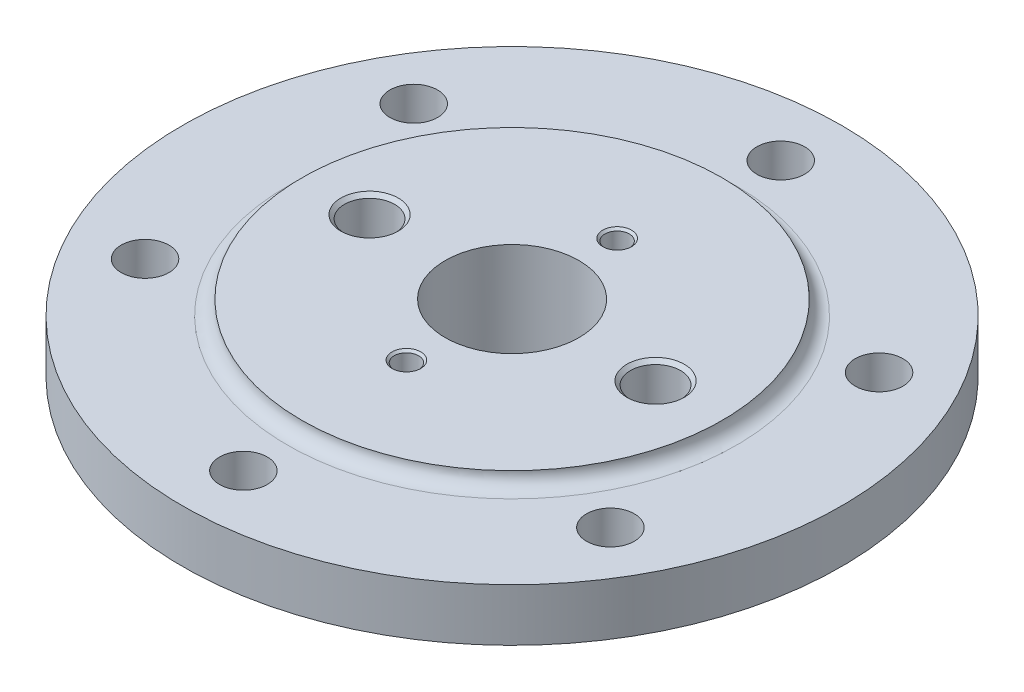
ISO-10303-21;
HEADER;
FILE_DESCRIPTION(('STEP AP214'),'2;1');
FILE_NAME('part.step','',(''),(''),'','','');
FILE_SCHEMA(('AUTOMOTIVE_DESIGN { 1 0 10303 214 1 1 1 1 }'));
ENDSEC;
DATA;
#1=APPLICATION_CONTEXT('core data for automotive mechanical design processes');
#2=APPLICATION_PROTOCOL_DEFINITION('international standard','automotive_design',2000,#1);
#3=PRODUCT_CONTEXT('',#1,'mechanical');
#4=PRODUCT('Part','Part','',(#3));
#5=PRODUCT_RELATED_PRODUCT_CATEGORY('part','',(#4));
#6=PRODUCT_DEFINITION_FORMATION('','',#4);
#7=PRODUCT_DEFINITION_CONTEXT('part definition',#1,'design');
#8=PRODUCT_DEFINITION('design','',#6,#7);
#9=PRODUCT_DEFINITION_SHAPE('','',#8);
#10=(LENGTH_UNIT() NAMED_UNIT(*) SI_UNIT(.MILLI.,.METRE.));
#11=(NAMED_UNIT(*) PLANE_ANGLE_UNIT() SI_UNIT($,.RADIAN.));
#12=(NAMED_UNIT(*) SI_UNIT($,.STERADIAN.) SOLID_ANGLE_UNIT());
#13=UNCERTAINTY_MEASURE_WITH_UNIT(LENGTH_MEASURE(1.E-05),#10,'distance_accuracy_value','');
#14=(GEOMETRIC_REPRESENTATION_CONTEXT(3) GLOBAL_UNCERTAINTY_ASSIGNED_CONTEXT((#13)) GLOBAL_UNIT_ASSIGNED_CONTEXT((#10,
#11,#12)) REPRESENTATION_CONTEXT('',''));
#15=CARTESIAN_POINT('',(0.,0.,0.));
#16=DIRECTION('',(0.,0.,1.));
#17=DIRECTION('',(1.,0.,0.));
#18=AXIS2_PLACEMENT_3D('',#15,#16,#17);
#19=CARTESIAN_POINT('',(35.,0.,0.));
#20=DIRECTION('',(0.,-1.,0.));
#21=DIRECTION('',(0.,0.,-1.));
#22=AXIS2_PLACEMENT_3D('',#19,#20,#21);
#23=PLANE('',#22);
#24=CARTESIAN_POINT('',(0.,0.,0.));
#25=DIRECTION('',(0.,-1.,0.));
#26=DIRECTION('',(0.,0.,-1.));
#27=AXIS2_PLACEMENT_3D('',#24,#25,#26);
#28=CIRCLE('',#27,35.);
#29=CARTESIAN_POINT('',(0.,0.,-35.));
#30=VERTEX_POINT('',#29);
#31=EDGE_CURVE('E11',#30,#30,#28,.T.);
#32=ORIENTED_EDGE('',*,*,#31,.T.);
#33=EDGE_LOOP('',(#32));
#34=FACE_BOUND('',#33,.T.);
#35=CARTESIAN_POINT('',(0.,0.,0.));
#36=DIRECTION('',(0.,-1.,0.));
#37=DIRECTION('',(0.,0.,-1.));
#38=AXIS2_PLACEMENT_3D('',#35,#36,#37);
#39=CIRCLE('',#38,7.);
#40=CARTESIAN_POINT('',(0.,0.,-7.));
#41=VERTEX_POINT('',#40);
#42=EDGE_CURVE('E123',#41,#41,#39,.T.);
#43=ORIENTED_EDGE('',*,*,#42,.F.);
#44=EDGE_LOOP('',(#43));
#45=FACE_BOUND('',#44,.T.);
#46=ADVANCED_FACE('F47',(#34,#45),#23,.T.);
#47=CARTESIAN_POINT('',(0.,0.,0.));
#48=DIRECTION('',(0.,1.,0.));
#49=DIRECTION('',(0.,0.,1.));
#50=AXIS2_PLACEMENT_3D('',#47,#48,#49);
#51=CONICAL_SURFACE('',#50,35.,0.774645889606347);
#52=CARTESIAN_POINT('',(0.,47.,0.));
#53=DIRECTION('',(0.,-1.,0.));
#54=DIRECTION('',(0.,0.,-1.));
#55=AXIS2_PLACEMENT_3D('',#52,#53,#54);
#56=CIRCLE('',#55,81.);
#57=CARTESIAN_POINT('',(0.,47.,-81.));
#58=VERTEX_POINT('',#57);
#59=EDGE_CURVE('E55',#58,#58,#56,.T.);
#60=ORIENTED_EDGE('',*,*,#59,.T.);
#61=EDGE_LOOP('',(#60));
#62=FACE_BOUND('',#61,.T.);
#63=ORIENTED_EDGE('',*,*,#31,.F.);
#64=EDGE_LOOP('',(#63));
#65=FACE_BOUND('',#64,.T.);
#66=ADVANCED_FACE('F162',(#62,#65),#51,.T.);
#67=CARTESIAN_POINT('',(0.,0.,0.));
#68=DIRECTION('',(0.,-1.,0.));
#69=DIRECTION('',(0.,0.,-1.));
#70=AXIS2_PLACEMENT_3D('',#67,#68,#69);
#71=CYLINDRICAL_SURFACE('',#70,81.);
#72=CARTESIAN_POINT('',(0.,53.,0.));
#73=DIRECTION('',(0.,-1.,0.));
#74=DIRECTION('',(0.,0.,-1.));
#75=AXIS2_PLACEMENT_3D('',#72,#73,#74);
#76=CIRCLE('',#75,81.);
#77=CARTESIAN_POINT('',(0.,53.,-81.));
#78=VERTEX_POINT('',#77);
#79=EDGE_CURVE('E155',#78,#78,#76,.T.);
#80=ORIENTED_EDGE('',*,*,#79,.T.);
#81=EDGE_LOOP('',(#80));
#82=FACE_BOUND('',#81,.T.);
#83=ORIENTED_EDGE('',*,*,#59,.F.);
#84=EDGE_LOOP('',(#83));
#85=FACE_BOUND('',#84,.T.);
#86=ADVANCED_FACE('F165',(#82,#85),#71,.T.);
#87=CARTESIAN_POINT('',(138.,53.,0.));
#88=DIRECTION('',(0.,-1.,0.));
#89=DIRECTION('',(0.,0.,-1.));
#90=AXIS2_PLACEMENT_3D('',#87,#88,#89);
#91=PLANE('',#90);
#92=CARTESIAN_POINT('',(0.,53.,-112.5));
#93=DIRECTION('',(0.,-1.,0.));
#94=DIRECTION('',(0.,0.,-1.));
#95=AXIS2_PLACEMENT_3D('',#92,#93,#94);
#96=CIRCLE('',#95,10.);
#97=CARTESIAN_POINT('',(0.,53.,-122.5));
#98=VERTEX_POINT('',#97);
#99=EDGE_CURVE('E303',#98,#98,#96,.F.);
#100=ORIENTED_EDGE('',*,*,#99,.T.);
#101=EDGE_LOOP('',(#100));
#102=FACE_BOUND('',#101,.T.);
#103=CARTESIAN_POINT('',(-97.4278579257487,53.,-56.2500000000012));
#104=DIRECTION('',(0.,-1.,0.));
#105=DIRECTION('',(0.,0.,-1.));
#106=AXIS2_PLACEMENT_3D('',#103,#104,#105);
#107=CIRCLE('',#106,10.);
#108=CARTESIAN_POINT('',(-97.4278579257487,53.,-66.2500000000012));
#109=VERTEX_POINT('',#108);
#110=EDGE_CURVE('E314',#109,#109,#107,.F.);
#111=ORIENTED_EDGE('',*,*,#110,.T.);
#112=EDGE_LOOP('',(#111));
#113=FACE_BOUND('',#112,.T.);
#114=CARTESIAN_POINT('',(-97.4278579257499,53.,56.2499999999991));
#115=DIRECTION('',(0.,-1.,0.));
#116=DIRECTION('',(0.,0.,-1.));
#117=AXIS2_PLACEMENT_3D('',#114,#115,#116);
#118=CIRCLE('',#117,10.);
#119=CARTESIAN_POINT('',(-97.4278579257499,53.,46.2499999999991));
#120=VERTEX_POINT('',#119);
#121=EDGE_CURVE('E342',#120,#120,#118,.F.);
#122=ORIENTED_EDGE('',*,*,#121,.T.);
#123=EDGE_LOOP('',(#122));
#124=FACE_BOUND('',#123,.T.);
#125=CARTESIAN_POINT('',(-7.85583301239705E-13,53.,112.5));
#126=DIRECTION('',(0.,-1.,0.));
#127=DIRECTION('',(0.,0.,-1.));
#128=AXIS2_PLACEMENT_3D('',#125,#126,#127);
#129=CIRCLE('',#128,10.);
#130=CARTESIAN_POINT('',(-7.85583301239705E-13,53.,102.5));
#131=VERTEX_POINT('',#130);
#132=EDGE_CURVE('E334',#131,#131,#129,.F.);
#133=ORIENTED_EDGE('',*,*,#132,.T.);
#134=EDGE_LOOP('',(#133));
#135=FACE_BOUND('',#134,.T.);
#136=CARTESIAN_POINT('',(97.4278579257491,53.,56.2500000000005));
#137=DIRECTION('',(0.,-1.,0.));
#138=DIRECTION('',(0.,0.,-1.));
#139=AXIS2_PLACEMENT_3D('',#136,#137,#138);
#140=CIRCLE('',#139,10.);
#141=CARTESIAN_POINT('',(97.4278579257491,53.,46.2500000000005));
#142=VERTEX_POINT('',#141);
#143=EDGE_CURVE('E326',#142,#142,#140,.F.);
#144=ORIENTED_EDGE('',*,*,#143,.T.);
#145=EDGE_LOOP('',(#144));
#146=FACE_BOUND('',#145,.T.);
#147=CARTESIAN_POINT('',(97.4278579257495,53.,-56.2499999999998));
#148=DIRECTION('',(0.,-1.,0.));
#149=DIRECTION('',(0.,0.,-1.));
#150=AXIS2_PLACEMENT_3D('',#147,#148,#149);
#151=CIRCLE('',#150,9.99999999999999);
#152=CARTESIAN_POINT('',(97.4278579257495,53.,-66.2499999999998));
#153=VERTEX_POINT('',#152);
#154=EDGE_CURVE('E305',#153,#153,#151,.F.);
#155=ORIENTED_EDGE('',*,*,#154,.T.);
#156=EDGE_LOOP('',(#155));
#157=FACE_BOUND('',#156,.T.);
#158=CARTESIAN_POINT('',(0.,53.,0.));
#159=DIRECTION('',(0.,-1.,0.));
#160=DIRECTION('',(0.,0.,-1.));
#161=AXIS2_PLACEMENT_3D('',#158,#159,#160);
#162=CIRCLE('',#161,138.);
#163=CARTESIAN_POINT('',(0.,53.,-138.));
#164=VERTEX_POINT('',#163);
#165=EDGE_CURVE('E151',#164,#164,#162,.T.);
#166=ORIENTED_EDGE('',*,*,#165,.T.);
#167=EDGE_LOOP('',(#166));
#168=FACE_BOUND('',#167,.T.);
#169=ORIENTED_EDGE('',*,*,#79,.F.);
#170=EDGE_LOOP('',(#169));
#171=FACE_BOUND('',#170,.T.);
#172=ADVANCED_FACE('F167',(#102,#113,#124,#135,#146,#157,#168,#171),#91,.T.);
#173=CARTESIAN_POINT('',(0.,0.,0.));
#174=DIRECTION('',(0.,-1.,0.));
#175=DIRECTION('',(0.,0.,-1.));
#176=AXIS2_PLACEMENT_3D('',#173,#174,#175);
#177=CYLINDRICAL_SURFACE('',#176,138.);
#178=CARTESIAN_POINT('',(0.,75.,0.));
#179=DIRECTION('',(0.,-1.,0.));
#180=DIRECTION('',(0.,0.,-1.));
#181=AXIS2_PLACEMENT_3D('',#178,#179,#180);
#182=CIRCLE('',#181,138.);
#183=CARTESIAN_POINT('',(0.,75.,-138.));
#184=VERTEX_POINT('',#183);
#185=EDGE_CURVE('E147',#184,#184,#182,.T.);
#186=ORIENTED_EDGE('',*,*,#185,.T.);
#187=EDGE_LOOP('',(#186));
#188=FACE_BOUND('',#187,.T.);
#189=ORIENTED_EDGE('',*,*,#165,.F.);
#190=EDGE_LOOP('',(#189));
#191=FACE_BOUND('',#190,.T.);
#192=ADVANCED_FACE('F174',(#188,#191),#177,.T.);
#193=CARTESIAN_POINT('',(94.,75.,0.));
#194=DIRECTION('',(0.,1.,0.));
#195=DIRECTION('',(0.,0.,1.));
#196=AXIS2_PLACEMENT_3D('',#193,#194,#195);
#197=PLANE('',#196);
#198=CARTESIAN_POINT('',(0.,75.,-112.5));
#199=DIRECTION('',(0.,1.,0.));
#200=DIRECTION('',(0.,0.,1.));
#201=AXIS2_PLACEMENT_3D('',#198,#199,#200);
#202=CIRCLE('',#201,10.);
#203=CARTESIAN_POINT('',(0.,75.,-102.5));
#204=VERTEX_POINT('',#203);
#205=EDGE_CURVE('E300',#204,#204,#202,.T.);
#206=ORIENTED_EDGE('',*,*,#205,.F.);
#207=EDGE_LOOP('',(#206));
#208=FACE_BOUND('',#207,.T.);
#209=CARTESIAN_POINT('',(-97.4278579257487,75.,-56.2500000000012));
#210=DIRECTION('',(0.,1.,0.));
#211=DIRECTION('',(0.,0.,1.));
#212=AXIS2_PLACEMENT_3D('',#209,#210,#211);
#213=CIRCLE('',#212,10.);
#214=CARTESIAN_POINT('',(-97.4278579257487,75.,-46.2500000000012));
#215=VERTEX_POINT('',#214);
#216=EDGE_CURVE('E319',#215,#215,#213,.T.);
#217=ORIENTED_EDGE('',*,*,#216,.F.);
#218=EDGE_LOOP('',(#217));
#219=FACE_BOUND('',#218,.T.);
#220=CARTESIAN_POINT('',(-97.4278579257499,75.,56.2499999999991));
#221=DIRECTION('',(0.,1.,0.));
#222=DIRECTION('',(0.,0.,1.));
#223=AXIS2_PLACEMENT_3D('',#220,#221,#222);
#224=CIRCLE('',#223,10.);
#225=CARTESIAN_POINT('',(-97.4278579257499,75.,66.2499999999991));
#226=VERTEX_POINT('',#225);
#227=EDGE_CURVE('E318',#226,#226,#224,.T.);
#228=ORIENTED_EDGE('',*,*,#227,.F.);
#229=EDGE_LOOP('',(#228));
#230=FACE_BOUND('',#229,.T.);
#231=CARTESIAN_POINT('',(-7.85583301239705E-13,75.,112.5));
#232=DIRECTION('',(0.,1.,0.));
#233=DIRECTION('',(0.,0.,1.));
#234=AXIS2_PLACEMENT_3D('',#231,#232,#233);
#235=CIRCLE('',#234,10.);
#236=CARTESIAN_POINT('',(-7.85583301239705E-13,75.,122.5));
#237=VERTEX_POINT('',#236);
#238=EDGE_CURVE('E338',#237,#237,#235,.T.);
#239=ORIENTED_EDGE('',*,*,#238,.F.);
#240=EDGE_LOOP('',(#239));
#241=FACE_BOUND('',#240,.T.);
#242=CARTESIAN_POINT('',(97.4278579257491,75.,56.2500000000005));
#243=DIRECTION('',(0.,1.,0.));
#244=DIRECTION('',(0.,0.,1.));
#245=AXIS2_PLACEMENT_3D('',#242,#243,#244);
#246=CIRCLE('',#245,10.);
#247=CARTESIAN_POINT('',(97.4278579257491,75.,66.2500000000005));
#248=VERTEX_POINT('',#247);
#249=EDGE_CURVE('E330',#248,#248,#246,.T.);
#250=ORIENTED_EDGE('',*,*,#249,.F.);
#251=EDGE_LOOP('',(#250));
#252=FACE_BOUND('',#251,.T.);
#253=CARTESIAN_POINT('',(97.4278579257495,75.,-56.2499999999998));
#254=DIRECTION('',(0.,1.,0.));
#255=DIRECTION('',(0.,0.,1.));
#256=AXIS2_PLACEMENT_3D('',#253,#254,#255);
#257=CIRCLE('',#256,9.99999999999999);
#258=CARTESIAN_POINT('',(97.4278579257495,75.,-46.2499999999998));
#259=VERTEX_POINT('',#258);
#260=EDGE_CURVE('E311',#259,#259,#257,.T.);
#261=ORIENTED_EDGE('',*,*,#260,.F.);
#262=EDGE_LOOP('',(#261));
#263=FACE_BOUND('',#262,.T.);
#264=CARTESIAN_POINT('',(0.,75.,0.));
#265=DIRECTION('',(0.,-1.,0.));
#266=DIRECTION('',(0.,0.,-1.));
#267=AXIS2_PLACEMENT_3D('',#264,#265,#266);
#268=CIRCLE('',#267,94.);
#269=CARTESIAN_POINT('',(0.,75.,-94.));
#270=VERTEX_POINT('',#269);
#271=EDGE_CURVE('E143',#270,#270,#268,.T.);
#272=ORIENTED_EDGE('',*,*,#271,.T.);
#273=EDGE_LOOP('',(#272));
#274=FACE_BOUND('',#273,.T.);
#275=ORIENTED_EDGE('',*,*,#185,.F.);
#276=EDGE_LOOP('',(#275));
#277=FACE_BOUND('',#276,.T.);
#278=ADVANCED_FACE('F214',(#208,#219,#230,#241,#252,#263,#274,#277),#197,.T.);
#279=CARTESIAN_POINT('',(0.,81.,0.));
#280=DIRECTION('',(0.,-1.,0.));
#281=DIRECTION('',(0.,0.,-1.));
#282=AXIS2_PLACEMENT_3D('',#279,#280,#281);
#283=TOROIDAL_SURFACE('',#282,94.,6.00000000000001);
#284=CARTESIAN_POINT('',(0.,81.,0.));
#285=DIRECTION('',(0.,-1.,0.));
#286=DIRECTION('',(0.,0.,-1.));
#287=AXIS2_PLACEMENT_3D('',#284,#285,#286);
#288=CIRCLE('',#287,88.);
#289=CARTESIAN_POINT('',(0.,81.,-88.));
#290=VERTEX_POINT('',#289);
#291=EDGE_CURVE('E139',#290,#290,#288,.T.);
#292=ORIENTED_EDGE('',*,*,#291,.T.);
#293=EDGE_LOOP('',(#292));
#294=FACE_BOUND('',#293,.T.);
#295=ORIENTED_EDGE('',*,*,#271,.F.);
#296=EDGE_LOOP('',(#295));
#297=FACE_BOUND('',#296,.T.);
#298=ADVANCED_FACE('F207',(#294,#297),#283,.F.);
#299=CARTESIAN_POINT('',(28.,81.,0.));
#300=DIRECTION('',(0.,1.,0.));
#301=DIRECTION('',(0.,0.,1.));
#302=AXIS2_PLACEMENT_3D('',#299,#300,#301);
#303=PLANE('',#302);
#304=CARTESIAN_POINT('',(-60.4802197209113,81.,-0.806402929612432));
#305=DIRECTION('',(0.,1.,0.));
#306=DIRECTION('',(0.,0.,1.));
#307=AXIS2_PLACEMENT_3D('',#304,#305,#306);
#308=CIRCLE('',#307,12.025);
#309=CARTESIAN_POINT('',(-60.4802197209113,81.,11.2185970703876));
#310=VERTEX_POINT('',#309);
#311=EDGE_CURVE('E88',#310,#310,#308,.T.);
#312=ORIENTED_EDGE('',*,*,#311,.F.);
#313=EDGE_LOOP('',(#312));
#314=FACE_BOUND('',#313,.T.);
#315=CARTESIAN_POINT('',(59.6738167912991,81.,-0.403201464806357));
#316=DIRECTION('',(0.,1.,0.));
#317=DIRECTION('',(0.,0.,1.));
#318=AXIS2_PLACEMENT_3D('',#315,#316,#317);
#319=CIRCLE('',#318,12.025);
#320=CARTESIAN_POINT('',(59.6738167912991,81.,11.6217985351937));
#321=VERTEX_POINT('',#320);
#322=EDGE_CURVE('E79',#321,#321,#319,.T.);
#323=ORIENTED_EDGE('',*,*,#322,.F.);
#324=EDGE_LOOP('',(#323));
#325=FACE_BOUND('',#324,.T.);
#326=CARTESIAN_POINT('',(0.,81.,-44.));
#327=DIRECTION('',(0.,1.,0.));
#328=DIRECTION('',(0.,0.,1.));
#329=AXIS2_PLACEMENT_3D('',#326,#327,#328);
#330=CIRCLE('',#329,6.025);
#331=CARTESIAN_POINT('',(0.,81.,-37.975));
#332=VERTEX_POINT('',#331);
#333=EDGE_CURVE('E99',#332,#332,#330,.T.);
#334=ORIENTED_EDGE('',*,*,#333,.F.);
#335=EDGE_LOOP('',(#334));
#336=FACE_BOUND('',#335,.T.);
#337=CARTESIAN_POINT('',(0.0355318338733923,81.,44.2777289266019));
#338=DIRECTION('',(0.,1.,0.));
#339=DIRECTION('',(0.,0.,1.));
#340=AXIS2_PLACEMENT_3D('',#337,#338,#339);
#341=CIRCLE('',#340,6.025);
#342=CARTESIAN_POINT('',(0.0355318338733923,81.,50.3027289266019));
#343=VERTEX_POINT('',#342);
#344=EDGE_CURVE('E111',#343,#343,#341,.T.);
#345=ORIENTED_EDGE('',*,*,#344,.F.);
#346=EDGE_LOOP('',(#345));
#347=FACE_BOUND('',#346,.T.);
#348=CARTESIAN_POINT('',(0.,81.,0.));
#349=DIRECTION('',(0.,-1.,0.));
#350=DIRECTION('',(0.,0.,-1.));
#351=AXIS2_PLACEMENT_3D('',#348,#349,#350);
#352=CIRCLE('',#351,28.);
#353=CARTESIAN_POINT('',(0.,81.,-28.));
#354=VERTEX_POINT('',#353);
#355=EDGE_CURVE('E135',#354,#354,#352,.T.);
#356=ORIENTED_EDGE('',*,*,#355,.T.);
#357=EDGE_LOOP('',(#356));
#358=FACE_BOUND('',#357,.T.);
#359=ORIENTED_EDGE('',*,*,#291,.F.);
#360=EDGE_LOOP('',(#359));
#361=FACE_BOUND('',#360,.T.);
#362=ADVANCED_FACE('F201',(#314,#325,#336,#347,#358,#361),#303,.T.);
#363=CARTESIAN_POINT('',(0.,0.,0.));
#364=DIRECTION('',(0.,-1.,0.));
#365=DIRECTION('',(0.,0.,-1.));
#366=AXIS2_PLACEMENT_3D('',#363,#364,#365);
#367=CYLINDRICAL_SURFACE('',#366,28.);
#368=CARTESIAN_POINT('',(0.,33.,0.));
#369=DIRECTION('',(0.,-1.,0.));
#370=DIRECTION('',(0.,0.,-1.));
#371=AXIS2_PLACEMENT_3D('',#368,#369,#370);
#372=CIRCLE('',#371,28.);
#373=CARTESIAN_POINT('',(0.,33.,28.));
#374=VERTEX_POINT('',#373);
#375=EDGE_CURVE('E131',#374,#374,#372,.T.);
#376=ORIENTED_EDGE('',*,*,#375,.T.);
#377=EDGE_LOOP('',(#376));
#378=FACE_BOUND('',#377,.T.);
#379=ORIENTED_EDGE('',*,*,#355,.F.);
#380=EDGE_LOOP('',(#379));
#381=FACE_BOUND('',#380,.T.);
#382=ADVANCED_FACE('F195',(#378,#381),#367,.F.);
#383=CARTESIAN_POINT('',(0.,33.,0.));
#384=DIRECTION('',(0.,1.,0.));
#385=DIRECTION('',(0.,0.,1.));
#386=AXIS2_PLACEMENT_3D('',#383,#384,#385);
#387=CONICAL_SURFACE('',#386,28.,1.0471975511966);
#388=CARTESIAN_POINT('',(0.,20.8756443470179,0.));
#389=DIRECTION('',(0.,-1.,0.));
#390=DIRECTION('',(0.,0.,-1.));
#391=AXIS2_PLACEMENT_3D('',#388,#389,#390);
#392=CIRCLE('',#391,7.);
#393=CARTESIAN_POINT('',(0.,20.8756443470179,7.));
#394=VERTEX_POINT('',#393);
#395=EDGE_CURVE('E127',#394,#394,#392,.T.);
#396=CARTESIAN_POINT('',(0.,20.8756443470179,7.));
#397=CARTESIAN_POINT('',(0.,21.0019397184032,7.21875));
#398=CARTESIAN_POINT('',(0.,21.1282350897884,7.4375));
#399=CARTESIAN_POINT('',(0.,21.3808258325589,7.875));
#400=CARTESIAN_POINT('',(0.,21.5071212039441,8.09375));
#401=CARTESIAN_POINT('',(0.,21.7597119467145,8.53125));
#402=CARTESIAN_POINT('',(0.,21.8860073180998,8.75));
#403=CARTESIAN_POINT('',(0.,22.1385980608702,9.1875));
#404=CARTESIAN_POINT('',(0.,22.2648934322555,9.40625));
#405=CARTESIAN_POINT('',(0.,22.5174841750259,9.84375));
#406=CARTESIAN_POINT('',(0.,22.6437795464112,10.0625));
#407=CARTESIAN_POINT('',(0.,22.8963702891816,10.5));
#408=CARTESIAN_POINT('',(0.,23.0226656605668,10.71875));
#409=CARTESIAN_POINT('',(0.,23.2752564033373,11.15625));
#410=CARTESIAN_POINT('',(0.,23.4015517747225,11.375));
#411=CARTESIAN_POINT('',(0.,23.654142517493,11.8125));
#412=CARTESIAN_POINT('',(0.,23.7804378888782,12.03125));
#413=CARTESIAN_POINT('',(0.,24.0330286316487,12.46875));
#414=CARTESIAN_POINT('',(0.,24.1593240030339,12.6875));
#415=CARTESIAN_POINT('',(0.,24.4119147458044,13.125));
#416=CARTESIAN_POINT('',(0.,24.5382101171896,13.34375));
#417=CARTESIAN_POINT('',(0.,24.7908008599601,13.78125));
#418=CARTESIAN_POINT('',(0.,24.9170962313453,14.));
#419=CARTESIAN_POINT('',(0.,25.1696869741158,14.4375));
#420=CARTESIAN_POINT('',(0.,25.295982345501,14.65625));
#421=CARTESIAN_POINT('',(0.,25.5485730882714,15.09375));
#422=CARTESIAN_POINT('',(0.,25.6748684596567,15.3125));
#423=CARTESIAN_POINT('',(0.,25.9274592024271,15.75));
#424=CARTESIAN_POINT('',(0.,26.0537545738124,15.96875));
#425=CARTESIAN_POINT('',(0.,26.3063453165828,16.40625));
#426=CARTESIAN_POINT('',(0.,26.4326406879681,16.625));
#427=CARTESIAN_POINT('',(0.,26.6852314307385,17.0625));
#428=CARTESIAN_POINT('',(0.,26.8115268021237,17.28125));
#429=CARTESIAN_POINT('',(0.,27.0641175448942,17.71875));
#430=CARTESIAN_POINT('',(0.,27.1904129162794,17.9375));
#431=CARTESIAN_POINT('',(0.,27.4430036590499,18.375));
#432=CARTESIAN_POINT('',(0.,27.5692990304351,18.59375));
#433=CARTESIAN_POINT('',(0.,27.8218897732056,19.03125));
#434=CARTESIAN_POINT('',(0.,27.9481851445908,19.25));
#435=CARTESIAN_POINT('',(0.,28.2007758873613,19.6875));
#436=CARTESIAN_POINT('',(0.,28.3270712587465,19.90625));
#437=CARTESIAN_POINT('',(0.,28.579662001517,20.34375));
#438=CARTESIAN_POINT('',(0.,28.7059573729022,20.5625));
#439=CARTESIAN_POINT('',(0.,28.9585481156727,21.));
#440=CARTESIAN_POINT('',(0.,29.0848434870579,21.21875));
#441=CARTESIAN_POINT('',(0.,29.3374342298284,21.65625));
#442=CARTESIAN_POINT('',(0.,29.4637296012136,21.875));
#443=CARTESIAN_POINT('',(0.,29.716320343984,22.3125));
#444=CARTESIAN_POINT('',(0.,29.8426157153693,22.53125));
#445=CARTESIAN_POINT('',(0.,30.0952064581397,22.96875));
#446=CARTESIAN_POINT('',(0.,30.221501829525,23.1875));
#447=CARTESIAN_POINT('',(0.,30.4740925722954,23.625));
#448=CARTESIAN_POINT('',(0.,30.6003879436807,23.84375));
#449=CARTESIAN_POINT('',(0.,30.8529786864511,24.28125));
#450=CARTESIAN_POINT('',(0.,30.9792740578363,24.5));
#451=CARTESIAN_POINT('',(0.,31.2318648006068,24.9375));
#452=CARTESIAN_POINT('',(0.,31.358160171992,25.15625));
#453=CARTESIAN_POINT('',(0.,31.6107509147625,25.59375));
#454=CARTESIAN_POINT('',(0.,31.7370462861477,25.8125));
#455=CARTESIAN_POINT('',(0.,31.9896370289182,26.25));
#456=CARTESIAN_POINT('',(0.,32.1159324003034,26.46875));
#457=CARTESIAN_POINT('',(0.,32.3685231430739,26.90625));
#458=CARTESIAN_POINT('',(0.,32.4948185144591,27.125));
#459=CARTESIAN_POINT('',(0.,32.7474092572296,27.5625));
#460=CARTESIAN_POINT('',(0.,32.8737046286148,27.78125));
#461=CARTESIAN_POINT('',(0.,33.,28.));
#462=B_SPLINE_CURVE_WITH_KNOTS('',3,(#396,#397,#398,#399,#400,#401,#402,#403,#404,#405,#406,
#407,#408,#409,#410,#411,#412,#413,#414,#415,#416,#417,#418,#419,#420,#421,#422,#423,#424,#425,
#426,#427,#428,#429,#430,#431,#432,#433,#434,#435,#436,#437,#438,#439,#440,#441,#442,#443,#444,
#445,#446,#447,#448,#449,#450,#451,#452,#453,#454,#455,#456,#457,#458,#459,#460,#461),
.UNSPECIFIED.,.F.,.F.,(4,2,2,2,2,2,2,2,2,2,2,2,2,2,2,2,2,2,2,2,2,2,2,2,2,2,2,2,2,2,2,2,4),(0.,
0.757772228311384,1.51554445662277,2.27331668493415,3.03108891324553,3.78886114155691,
4.5466333698683,5.30440559817968,6.06217782649106,6.81995005480245,7.57772228311383,
8.33549451142521,9.0932667397366,9.85103896804798,10.6088111963594,11.3665834246707,
12.1243556529821,12.8821278812935,13.6399001096049,14.3976723379163,15.1554445662277,
15.913216794539,16.6709890228504,17.4287612511618,18.1865334794732,18.9443057077846,
19.702077936096,20.4598501644073,21.2176223927187,21.9753946210301,22.7331668493415,
23.4909390776529,24.2487113059643),.UNSPECIFIED.);
#463=EDGE_CURVE('BSEAM189',#394,#374,#462,.T.);
#464=ORIENTED_EDGE('',*,*,#395,.T.);
#465=ORIENTED_EDGE('',*,*,#375,.F.);
#466=ORIENTED_EDGE('',*,*,#463,.T.);
#467=ORIENTED_EDGE('',*,*,#463,.F.);
#468=EDGE_LOOP('',(#464,#466,#465,#467));
#469=FACE_BOUND('',#468,.T.);
#470=ADVANCED_FACE('F189',(#469),#387,.F.);
#471=CARTESIAN_POINT('',(0.,0.,0.));
#472=DIRECTION('',(0.,-1.,0.));
#473=DIRECTION('',(0.,0.,-1.));
#474=AXIS2_PLACEMENT_3D('',#471,#472,#473);
#475=CYLINDRICAL_SURFACE('',#474,7.);
#476=ORIENTED_EDGE('',*,*,#42,.T.);
#477=EDGE_LOOP('',(#476));
#478=FACE_BOUND('',#477,.T.);
#479=ORIENTED_EDGE('',*,*,#395,.F.);
#480=EDGE_LOOP('',(#479));
#481=FACE_BOUND('',#480,.T.);
#482=ADVANCED_FACE('F185',(#478,#481),#475,.F.);
#483=CARTESIAN_POINT('',(0.0355318338733923,66.,44.2777289266019));
#484=DIRECTION('',(0.,1.,0.));
#485=DIRECTION('',(0.,0.,1.));
#486=AXIS2_PLACEMENT_3D('',#483,#484,#485);
#487=CONICAL_SURFACE('',#486,5.1,1.02974425867665);
#488=CARTESIAN_POINT('',(0.0355318338733879,62.9356108429595,44.2777289266019));
#489=VERTEX_POINT('',#488);
#490=VERTEX_LOOP('',#489);
#491=FACE_BOUND('',#490,.T.);
#492=CARTESIAN_POINT('',(0.0355318338733923,66.,44.2777289266019));
#493=DIRECTION('',(0.,1.,0.));
#494=DIRECTION('',(0.,0.,1.));
#495=AXIS2_PLACEMENT_3D('',#492,#493,#494);
#496=CIRCLE('',#495,5.1);
#497=CARTESIAN_POINT('',(0.0355318338733923,66.,49.3777289266019));
#498=VERTEX_POINT('',#497);
#499=EDGE_CURVE('E119',#498,#498,#496,.T.);
#500=ORIENTED_EDGE('',*,*,#499,.T.);
#501=EDGE_LOOP('',(#500));
#502=FACE_BOUND('',#501,.T.);
#503=ADVANCED_FACE('F188',(#491,#502),#487,.F.);
#504=CARTESIAN_POINT('',(0.0355318338733923,81.,44.2777289266019));
#505=DIRECTION('',(0.,1.,0.));
#506=DIRECTION('',(0.,0.,1.));
#507=AXIS2_PLACEMENT_3D('',#504,#505,#506);
#508=CYLINDRICAL_SURFACE('',#507,5.1);
#509=ORIENTED_EDGE('',*,*,#499,.F.);
#510=EDGE_LOOP('',(#509));
#511=FACE_BOUND('',#510,.T.);
#512=CARTESIAN_POINT('',(0.0355318338733923,80.075,44.2777289266019));
#513=DIRECTION('',(0.,1.,0.));
#514=DIRECTION('',(0.,0.,1.));
#515=AXIS2_PLACEMENT_3D('',#512,#513,#514);
#516=CIRCLE('',#515,5.1);
#517=CARTESIAN_POINT('',(0.0355318338733923,80.075,49.3777289266019));
#518=VERTEX_POINT('',#517);
#519=EDGE_CURVE('E115',#518,#518,#516,.T.);
#520=ORIENTED_EDGE('',*,*,#519,.T.);
#521=EDGE_LOOP('',(#520));
#522=FACE_BOUND('',#521,.T.);
#523=ADVANCED_FACE('F236',(#511,#522),#508,.F.);
#524=CARTESIAN_POINT('',(0.0355318338733923,81.,44.2777289266019));
#525=DIRECTION('',(0.,1.,0.));
#526=DIRECTION('',(0.,0.,1.));
#527=AXIS2_PLACEMENT_3D('',#524,#525,#526);
#528=CONICAL_SURFACE('',#527,6.025,0.785398163397446);
#529=ORIENTED_EDGE('',*,*,#519,.F.);
#530=EDGE_LOOP('',(#529));
#531=FACE_BOUND('',#530,.T.);
#532=ORIENTED_EDGE('',*,*,#344,.T.);
#533=EDGE_LOOP('',(#532));
#534=FACE_BOUND('',#533,.T.);
#535=ADVANCED_FACE('F239',(#531,#534),#528,.F.);
#536=CARTESIAN_POINT('',(0.,66.,-44.));
#537=DIRECTION('',(0.,1.,0.));
#538=DIRECTION('',(0.,0.,1.));
#539=AXIS2_PLACEMENT_3D('',#536,#537,#538);
#540=CONICAL_SURFACE('',#539,5.1,1.02974425867665);
#541=CARTESIAN_POINT('',(0.,62.9356108429595,-44.));
#542=VERTEX_POINT('',#541);
#543=VERTEX_LOOP('',#542);
#544=FACE_BOUND('',#543,.T.);
#545=CARTESIAN_POINT('',(0.,66.,-44.));
#546=DIRECTION('',(0.,1.,0.));
#547=DIRECTION('',(0.,0.,1.));
#548=AXIS2_PLACEMENT_3D('',#545,#546,#547);
#549=CIRCLE('',#548,5.1);
#550=CARTESIAN_POINT('',(0.,66.,-38.9));
#551=VERTEX_POINT('',#550);
#552=EDGE_CURVE('E107',#551,#551,#549,.T.);
#553=ORIENTED_EDGE('',*,*,#552,.T.);
#554=EDGE_LOOP('',(#553));
#555=FACE_BOUND('',#554,.T.);
#556=ADVANCED_FACE('F243',(#544,#555),#540,.F.);
#557=CARTESIAN_POINT('',(0.,81.,-44.));
#558=DIRECTION('',(0.,1.,0.));
#559=DIRECTION('',(0.,0.,1.));
#560=AXIS2_PLACEMENT_3D('',#557,#558,#559);
#561=CYLINDRICAL_SURFACE('',#560,5.09999999999999);
#562=ORIENTED_EDGE('',*,*,#552,.F.);
#563=EDGE_LOOP('',(#562));
#564=FACE_BOUND('',#563,.T.);
#565=CARTESIAN_POINT('',(0.,80.075,-44.));
#566=DIRECTION('',(0.,1.,0.));
#567=DIRECTION('',(0.,0.,1.));
#568=AXIS2_PLACEMENT_3D('',#565,#566,#567);
#569=CIRCLE('',#568,5.09999999999999);
#570=CARTESIAN_POINT('',(0.,80.075,-38.9));
#571=VERTEX_POINT('',#570);
#572=EDGE_CURVE('E103',#571,#571,#569,.T.);
#573=ORIENTED_EDGE('',*,*,#572,.T.);
#574=EDGE_LOOP('',(#573));
#575=FACE_BOUND('',#574,.T.);
#576=ADVANCED_FACE('F247',(#564,#575),#561,.F.);
#577=CARTESIAN_POINT('',(0.,81.,-44.));
#578=DIRECTION('',(0.,1.,0.));
#579=DIRECTION('',(0.,0.,1.));
#580=AXIS2_PLACEMENT_3D('',#577,#578,#579);
#581=CONICAL_SURFACE('',#580,6.025,0.785398163397443);
#582=ORIENTED_EDGE('',*,*,#572,.F.);
#583=EDGE_LOOP('',(#582));
#584=FACE_BOUND('',#583,.T.);
#585=ORIENTED_EDGE('',*,*,#333,.T.);
#586=EDGE_LOOP('',(#585));
#587=FACE_BOUND('',#586,.T.);
#588=ADVANCED_FACE('F250',(#584,#587),#581,.F.);
#589=CARTESIAN_POINT('',(59.6738167912991,48.,-0.403201464806357));
#590=DIRECTION('',(0.,1.,0.));
#591=DIRECTION('',(0.,0.,1.));
#592=AXIS2_PLACEMENT_3D('',#589,#590,#591);
#593=CONICAL_SURFACE('',#592,10.5,1.02974425867665);
#594=CARTESIAN_POINT('',(59.6738167912991,41.6909635002106,-0.403201464806357));
#595=VERTEX_POINT('',#594);
#596=VERTEX_LOOP('',#595);
#597=FACE_BOUND('',#596,.T.);
#598=CARTESIAN_POINT('',(59.6738167912991,48.,-0.403201464806357));
#599=DIRECTION('',(0.,1.,0.));
#600=DIRECTION('',(0.,0.,1.));
#601=AXIS2_PLACEMENT_3D('',#598,#599,#600);
#602=CIRCLE('',#601,10.5);
#603=CARTESIAN_POINT('',(59.6738167912991,48.,10.0967985351936));
#604=VERTEX_POINT('',#603);
#605=EDGE_CURVE('E95',#604,#604,#602,.T.);
#606=ORIENTED_EDGE('',*,*,#605,.T.);
#607=EDGE_LOOP('',(#606));
#608=FACE_BOUND('',#607,.T.);
#609=ADVANCED_FACE('F254',(#597,#608),#593,.F.);
#610=CARTESIAN_POINT('',(59.6738167912991,81.,-0.403201464806357));
#611=DIRECTION('',(0.,1.,0.));
#612=DIRECTION('',(0.,0.,1.));
#613=AXIS2_PLACEMENT_3D('',#610,#611,#612);
#614=CYLINDRICAL_SURFACE('',#613,10.5);
#615=ORIENTED_EDGE('',*,*,#605,.F.);
#616=EDGE_LOOP('',(#615));
#617=FACE_BOUND('',#616,.T.);
#618=CARTESIAN_POINT('',(59.6738167912991,79.475,-0.403201464806357));
#619=DIRECTION('',(0.,1.,0.));
#620=DIRECTION('',(0.,0.,1.));
#621=AXIS2_PLACEMENT_3D('',#618,#619,#620);
#622=CIRCLE('',#621,10.5);
#623=CARTESIAN_POINT('',(59.6738167912991,79.475,10.0967985351936));
#624=VERTEX_POINT('',#623);
#625=EDGE_CURVE('E85',#624,#624,#622,.T.);
#626=ORIENTED_EDGE('',*,*,#625,.T.);
#627=EDGE_LOOP('',(#626));
#628=FACE_BOUND('',#627,.T.);
#629=ADVANCED_FACE('F258',(#617,#628),#614,.F.);
#630=CARTESIAN_POINT('',(59.6738167912991,81.,-0.403201464806357));
#631=DIRECTION('',(0.,1.,0.));
#632=DIRECTION('',(0.,0.,1.));
#633=AXIS2_PLACEMENT_3D('',#630,#631,#632);
#634=CONICAL_SURFACE('',#633,12.025,0.785398163397453);
#635=ORIENTED_EDGE('',*,*,#625,.F.);
#636=EDGE_LOOP('',(#635));
#637=FACE_BOUND('',#636,.T.);
#638=ORIENTED_EDGE('',*,*,#322,.T.);
#639=EDGE_LOOP('',(#638));
#640=FACE_BOUND('',#639,.T.);
#641=ADVANCED_FACE('F72',(#637,#640),#634,.F.);
#642=CARTESIAN_POINT('',(-60.4802197209113,48.,-0.806402929612432));
#643=DIRECTION('',(0.,1.,0.));
#644=DIRECTION('',(0.,0.,1.));
#645=AXIS2_PLACEMENT_3D('',#642,#643,#644);
#646=CONICAL_SURFACE('',#645,10.5,1.02974425867665);
#647=CARTESIAN_POINT('',(-60.4802197209113,41.6909635002106,-0.806402929612432));
#648=VERTEX_POINT('',#647);
#649=VERTEX_LOOP('',#648);
#650=FACE_BOUND('',#649,.T.);
#651=CARTESIAN_POINT('',(-60.4802197209113,48.,-0.806402929612432));
#652=DIRECTION('',(0.,1.,0.));
#653=DIRECTION('',(0.,0.,1.));
#654=AXIS2_PLACEMENT_3D('',#651,#652,#653);
#655=CIRCLE('',#654,10.5);
#656=CARTESIAN_POINT('',(-60.4802197209113,48.,9.69359707038755));
#657=VERTEX_POINT('',#656);
#658=EDGE_CURVE('E76',#657,#657,#655,.T.);
#659=ORIENTED_EDGE('',*,*,#658,.T.);
#660=EDGE_LOOP('',(#659));
#661=FACE_BOUND('',#660,.T.);
#662=ADVANCED_FACE('F68',(#650,#661),#646,.F.);
#663=CARTESIAN_POINT('',(-60.4802197209113,81.,-0.806402929612432));
#664=DIRECTION('',(0.,1.,0.));
#665=DIRECTION('',(0.,0.,1.));
#666=AXIS2_PLACEMENT_3D('',#663,#664,#665);
#667=CYLINDRICAL_SURFACE('',#666,10.5);
#668=ORIENTED_EDGE('',*,*,#658,.F.);
#669=EDGE_LOOP('',(#668));
#670=FACE_BOUND('',#669,.T.);
#671=CARTESIAN_POINT('',(-60.4802197209113,79.475,-0.806402929612432));
#672=DIRECTION('',(0.,1.,0.));
#673=DIRECTION('',(0.,0.,1.));
#674=AXIS2_PLACEMENT_3D('',#671,#672,#673);
#675=CIRCLE('',#674,10.5);
#676=CARTESIAN_POINT('',(-60.4802197209113,79.475,9.69359707038756));
#677=VERTEX_POINT('',#676);
#678=EDGE_CURVE('E80',#677,#677,#675,.T.);
#679=ORIENTED_EDGE('',*,*,#678,.T.);
#680=EDGE_LOOP('',(#679));
#681=FACE_BOUND('',#680,.T.);
#682=ADVANCED_FACE('F71',(#670,#681),#667,.F.);
#683=CARTESIAN_POINT('',(-60.4802197209113,81.,-0.806402929612432));
#684=DIRECTION('',(0.,1.,0.));
#685=DIRECTION('',(0.,0.,1.));
#686=AXIS2_PLACEMENT_3D('',#683,#684,#685);
#687=CONICAL_SURFACE('',#686,12.025,0.785398163397453);
#688=ORIENTED_EDGE('',*,*,#678,.F.);
#689=EDGE_LOOP('',(#688));
#690=FACE_BOUND('',#689,.T.);
#691=ORIENTED_EDGE('',*,*,#311,.T.);
#692=EDGE_LOOP('',(#691));
#693=FACE_BOUND('',#692,.T.);
#694=ADVANCED_FACE('F268',(#690,#693),#687,.F.);
#695=CARTESIAN_POINT('',(97.4278579257495,-0.002000000000002,-56.2499999999998));
#696=DIRECTION('',(0.,1.,0.));
#697=DIRECTION('',(0.,0.,1.));
#698=AXIS2_PLACEMENT_3D('',#695,#696,#697);
#699=CYLINDRICAL_SURFACE('',#698,9.99999999999999);
#700=ORIENTED_EDGE('',*,*,#260,.T.);
#701=EDGE_LOOP('',(#700));
#702=FACE_BOUND('',#701,.T.);
#703=ORIENTED_EDGE('',*,*,#154,.F.);
#704=EDGE_LOOP('',(#703));
#705=FACE_BOUND('',#704,.T.);
#706=ADVANCED_FACE('F271',(#702,#705),#699,.F.);
#707=CARTESIAN_POINT('',(97.4278579257491,-0.002000000000002,56.2500000000005));
#708=DIRECTION('',(0.,1.,0.));
#709=DIRECTION('',(0.,0.,1.));
#710=AXIS2_PLACEMENT_3D('',#707,#708,#709);
#711=CYLINDRICAL_SURFACE('',#710,10.);
#712=ORIENTED_EDGE('',*,*,#249,.T.);
#713=EDGE_LOOP('',(#712));
#714=FACE_BOUND('',#713,.T.);
#715=ORIENTED_EDGE('',*,*,#143,.F.);
#716=EDGE_LOOP('',(#715));
#717=FACE_BOUND('',#716,.T.);
#718=ADVANCED_FACE('F281',(#714,#717),#711,.F.);
#719=CARTESIAN_POINT('',(-7.85583301239705E-13,-0.002000000000002,112.5));
#720=DIRECTION('',(0.,1.,0.));
#721=DIRECTION('',(0.,0.,1.));
#722=AXIS2_PLACEMENT_3D('',#719,#720,#721);
#723=CYLINDRICAL_SURFACE('',#722,10.);
#724=ORIENTED_EDGE('',*,*,#238,.T.);
#725=EDGE_LOOP('',(#724));
#726=FACE_BOUND('',#725,.T.);
#727=ORIENTED_EDGE('',*,*,#132,.F.);
#728=EDGE_LOOP('',(#727));
#729=FACE_BOUND('',#728,.T.);
#730=ADVANCED_FACE('F277',(#726,#729),#723,.F.);
#731=CARTESIAN_POINT('',(-97.4278579257499,-0.002000000000002,56.2499999999991));
#732=DIRECTION('',(0.,1.,0.));
#733=DIRECTION('',(0.,0.,1.));
#734=AXIS2_PLACEMENT_3D('',#731,#732,#733);
#735=CYLINDRICAL_SURFACE('',#734,10.);
#736=ORIENTED_EDGE('',*,*,#227,.T.);
#737=EDGE_LOOP('',(#736));
#738=FACE_BOUND('',#737,.T.);
#739=ORIENTED_EDGE('',*,*,#121,.F.);
#740=EDGE_LOOP('',(#739));
#741=FACE_BOUND('',#740,.T.);
#742=ADVANCED_FACE('F273',(#738,#741),#735,.F.);
#743=CARTESIAN_POINT('',(-97.4278579257487,-0.002000000000002,-56.2500000000012));
#744=DIRECTION('',(0.,1.,0.));
#745=DIRECTION('',(0.,0.,1.));
#746=AXIS2_PLACEMENT_3D('',#743,#744,#745);
#747=CYLINDRICAL_SURFACE('',#746,10.);
#748=ORIENTED_EDGE('',*,*,#216,.T.);
#749=EDGE_LOOP('',(#748));
#750=FACE_BOUND('',#749,.T.);
#751=ORIENTED_EDGE('',*,*,#110,.F.);
#752=EDGE_LOOP('',(#751));
#753=FACE_BOUND('',#752,.T.);
#754=ADVANCED_FACE('F276',(#750,#753),#747,.F.);
#755=CARTESIAN_POINT('',(0.,-0.002000000000002,-112.5));
#756=DIRECTION('',(0.,1.,0.));
#757=DIRECTION('',(0.,0.,1.));
#758=AXIS2_PLACEMENT_3D('',#755,#756,#757);
#759=CYLINDRICAL_SURFACE('',#758,10.);
#760=ORIENTED_EDGE('',*,*,#205,.T.);
#761=EDGE_LOOP('',(#760));
#762=FACE_BOUND('',#761,.T.);
#763=ORIENTED_EDGE('',*,*,#99,.F.);
#764=EDGE_LOOP('',(#763));
#765=FACE_BOUND('',#764,.T.);
#766=ADVANCED_FACE('F291',(#762,#765),#759,.F.);
#767=CLOSED_SHELL('',(#46,#66,#86,#172,#192,#278,#298,#362,#382,#470,#482,#503,#523,#535,#556,
#576,#588,#609,#629,#641,#662,#682,#694,#706,#718,#730,#742,#754,#766));
#768=MANIFOLD_SOLID_BREP('B2',#767);
#769=ADVANCED_BREP_SHAPE_REPRESENTATION('',(#18,#768),#14);
#770=SHAPE_DEFINITION_REPRESENTATION(#9,#769);
ENDSEC;
END-ISO-10303-21;
